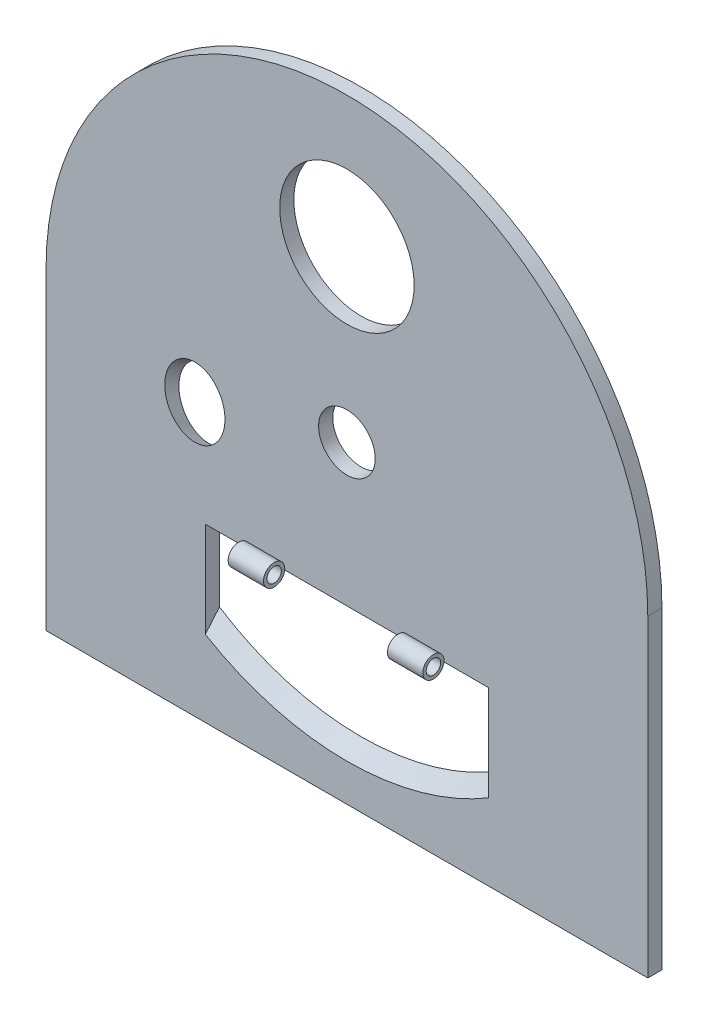
ISO-10303-21;
HEADER;
FILE_DESCRIPTION(('STEP AP214'),'2;1');
FILE_NAME('part.step','',(''),(''),'','','');
FILE_SCHEMA(('AUTOMOTIVE_DESIGN { 1 0 10303 214 1 1 1 1 }'));
ENDSEC;
DATA;
#1=APPLICATION_CONTEXT('core data for automotive mechanical design processes');
#2=APPLICATION_PROTOCOL_DEFINITION('international standard','automotive_design',2000,#1);
#3=PRODUCT_CONTEXT('',#1,'mechanical');
#4=PRODUCT('Part','Part','',(#3));
#5=PRODUCT_RELATED_PRODUCT_CATEGORY('part','',(#4));
#6=PRODUCT_DEFINITION_FORMATION('','',#4);
#7=PRODUCT_DEFINITION_CONTEXT('part definition',#1,'design');
#8=PRODUCT_DEFINITION('design','',#6,#7);
#9=PRODUCT_DEFINITION_SHAPE('','',#8);
#10=(LENGTH_UNIT() NAMED_UNIT(*) SI_UNIT(.MILLI.,.METRE.));
#11=(NAMED_UNIT(*) PLANE_ANGLE_UNIT() SI_UNIT($,.RADIAN.));
#12=(NAMED_UNIT(*) SI_UNIT($,.STERADIAN.) SOLID_ANGLE_UNIT());
#13=UNCERTAINTY_MEASURE_WITH_UNIT(LENGTH_MEASURE(1.E-05),#10,'distance_accuracy_value','');
#14=(GEOMETRIC_REPRESENTATION_CONTEXT(3) GLOBAL_UNCERTAINTY_ASSIGNED_CONTEXT((#13)) GLOBAL_UNIT_ASSIGNED_CONTEXT((#10,
#11,#12)) REPRESENTATION_CONTEXT('',''));
#15=CARTESIAN_POINT('',(0.,0.,0.));
#16=DIRECTION('',(0.,0.,1.));
#17=DIRECTION('',(1.,0.,0.));
#18=AXIS2_PLACEMENT_3D('',#15,#16,#17);
#19=CARTESIAN_POINT('',(-35.,-79.2179302255812,14.1223869730976));
#20=DIRECTION('',(1.,0.,0.));
#21=DIRECTION('',(0.,-1.,0.));
#22=AXIS2_PLACEMENT_3D('',#19,#20,#21);
#23=PLANE('',#22);
#24=CARTESIAN_POINT('',(-35.,-79.2179302255812,14.1223869730976));
#25=DIRECTION('',(-1.,0.,0.));
#26=DIRECTION('',(0.,-1.,0.));
#27=AXIS2_PLACEMENT_3D('',#24,#25,#26);
#28=CIRCLE('',#27,6.00000000000002);
#29=CARTESIAN_POINT('',(-35.,-85.2179302255812,14.1223869730976));
#30=VERTEX_POINT('',#29);
#31=EDGE_CURVE('E11',#30,#30,#28,.T.);
#32=ORIENTED_EDGE('',*,*,#31,.F.);
#33=EDGE_LOOP('',(#32));
#34=FACE_BOUND('',#33,.T.);
#35=CARTESIAN_POINT('',(-35.,-79.2179302255812,14.1223869730976));
#36=DIRECTION('',(-1.,0.,0.));
#37=DIRECTION('',(0.,-1.,0.));
#38=AXIS2_PLACEMENT_3D('',#35,#36,#37);
#39=CIRCLE('',#38,4.07996408059991);
#40=CARTESIAN_POINT('',(-35.,-83.2978943061811,14.1223869730976));
#41=VERTEX_POINT('',#40);
#42=EDGE_CURVE('E51',#41,#41,#39,.T.);
#43=ORIENTED_EDGE('',*,*,#42,.T.);
#44=EDGE_LOOP('',(#43));
#45=FACE_BOUND('',#44,.T.);
#46=ADVANCED_FACE('F40',(#34,#45),#23,.T.);
#47=CARTESIAN_POINT('',(-55.,-79.2179302255812,14.1223869730976));
#48=DIRECTION('',(1.,0.,0.));
#49=DIRECTION('',(0.,-1.,0.));
#50=AXIS2_PLACEMENT_3D('',#47,#48,#49);
#51=PLANE('',#50);
#52=CARTESIAN_POINT('',(-55.,-79.2179302255812,14.1223869730976));
#53=DIRECTION('',(-1.,0.,0.));
#54=DIRECTION('',(0.,-1.,0.));
#55=AXIS2_PLACEMENT_3D('',#52,#53,#54);
#56=CIRCLE('',#55,6.00000000000002);
#57=CARTESIAN_POINT('',(-55.,-85.2179302255812,14.1223869730976));
#58=VERTEX_POINT('',#57);
#59=EDGE_CURVE('E44',#58,#58,#56,.T.);
#60=ORIENTED_EDGE('',*,*,#59,.T.);
#61=EDGE_LOOP('',(#60));
#62=FACE_BOUND('',#61,.T.);
#63=CARTESIAN_POINT('',(-55.,-79.2179302255812,14.1223869730976));
#64=DIRECTION('',(-1.,0.,0.));
#65=DIRECTION('',(0.,-1.,0.));
#66=AXIS2_PLACEMENT_3D('',#63,#64,#65);
#67=CIRCLE('',#66,4.07996408059991);
#68=CARTESIAN_POINT('',(-55.,-83.2978943061811,14.1223869730976));
#69=VERTEX_POINT('',#68);
#70=EDGE_CURVE('E53',#69,#69,#67,.T.);
#71=ORIENTED_EDGE('',*,*,#70,.F.);
#72=EDGE_LOOP('',(#71));
#73=FACE_BOUND('',#72,.T.);
#74=ADVANCED_FACE('F66',(#62,#73),#51,.F.);
#75=CARTESIAN_POINT('',(-35.,-79.2179302255812,14.1223869730976));
#76=DIRECTION('',(-1.,0.,0.));
#77=DIRECTION('',(0.,1.,0.));
#78=AXIS2_PLACEMENT_3D('',#75,#76,#77);
#79=CYLINDRICAL_SURFACE('',#78,6.00000000000002);
#80=ORIENTED_EDGE('',*,*,#31,.T.);
#81=EDGE_LOOP('',(#80));
#82=FACE_BOUND('',#81,.T.);
#83=ORIENTED_EDGE('',*,*,#59,.F.);
#84=EDGE_LOOP('',(#83));
#85=FACE_BOUND('',#84,.T.);
#86=ADVANCED_FACE('F42',(#82,#85),#79,.T.);
#87=CARTESIAN_POINT('',(-35.,-79.2179302255812,14.1223869730976));
#88=DIRECTION('',(-1.,0.,0.));
#89=DIRECTION('',(0.,1.,0.));
#90=AXIS2_PLACEMENT_3D('',#87,#88,#89);
#91=CYLINDRICAL_SURFACE('',#90,4.07996408059991);
#92=ORIENTED_EDGE('',*,*,#42,.F.);
#93=EDGE_LOOP('',(#92));
#94=FACE_BOUND('',#93,.T.);
#95=ORIENTED_EDGE('',*,*,#70,.T.);
#96=EDGE_LOOP('',(#95));
#97=FACE_BOUND('',#96,.T.);
#98=ADVANCED_FACE('F60',(#94,#97),#91,.F.);
#99=CLOSED_SHELL('',(#46,#74,#86,#98));
#100=MANIFOLD_SOLID_BREP('B2',#99);
#101=CARTESIAN_POINT('',(35.,-79.2179302255812,14.1223869730976));
#102=DIRECTION('',(-1.,0.,0.));
#103=DIRECTION('',(0.,-1.,0.));
#104=AXIS2_PLACEMENT_3D('',#101,#102,#103);
#105=PLANE('',#104);
#106=CARTESIAN_POINT('',(35.,-79.2179302255812,14.1223869730976));
#107=DIRECTION('',(-1.,0.,0.));
#108=DIRECTION('',(0.,-1.,0.));
#109=AXIS2_PLACEMENT_3D('',#106,#107,#108);
#110=CIRCLE('',#109,6.00000000000002);
#111=CARTESIAN_POINT('',(35.,-85.2179302255812,14.1223869730976));
#112=VERTEX_POINT('',#111);
#113=EDGE_CURVE('E39',#112,#112,#110,.T.);
#114=ORIENTED_EDGE('',*,*,#113,.T.);
#115=EDGE_LOOP('',(#114));
#116=FACE_BOUND('',#115,.T.);
#117=CARTESIAN_POINT('',(35.,-79.2179302255812,14.1223869730976));
#118=DIRECTION('',(-1.,0.,0.));
#119=DIRECTION('',(0.,-1.,0.));
#120=AXIS2_PLACEMENT_3D('',#117,#118,#119);
#121=CIRCLE('',#120,4.07996408059991);
#122=CARTESIAN_POINT('',(35.,-83.2978943061811,14.1223869730976));
#123=VERTEX_POINT('',#122);
#124=EDGE_CURVE('E122',#123,#123,#121,.T.);
#125=ORIENTED_EDGE('',*,*,#124,.F.);
#126=EDGE_LOOP('',(#125));
#127=FACE_BOUND('',#126,.T.);
#128=ADVANCED_FACE('F111',(#116,#127),#105,.T.);
#129=CARTESIAN_POINT('',(55.,-79.2179302255812,14.1223869730976));
#130=DIRECTION('',(-1.,0.,0.));
#131=DIRECTION('',(0.,-1.,0.));
#132=AXIS2_PLACEMENT_3D('',#129,#130,#131);
#133=PLANE('',#132);
#134=CARTESIAN_POINT('',(55.,-79.2179302255812,14.1223869730976));
#135=DIRECTION('',(-1.,0.,0.));
#136=DIRECTION('',(0.,-1.,0.));
#137=AXIS2_PLACEMENT_3D('',#134,#135,#136);
#138=CIRCLE('',#137,6.00000000000002);
#139=CARTESIAN_POINT('',(55.,-85.2179302255812,14.1223869730976));
#140=VERTEX_POINT('',#139);
#141=EDGE_CURVE('E115',#140,#140,#138,.T.);
#142=ORIENTED_EDGE('',*,*,#141,.F.);
#143=EDGE_LOOP('',(#142));
#144=FACE_BOUND('',#143,.T.);
#145=CARTESIAN_POINT('',(55.,-79.2179302255812,14.1223869730976));
#146=DIRECTION('',(-1.,0.,0.));
#147=DIRECTION('',(0.,-1.,0.));
#148=AXIS2_PLACEMENT_3D('',#145,#146,#147);
#149=CIRCLE('',#148,4.07996408059991);
#150=CARTESIAN_POINT('',(55.,-83.2978943061811,14.1223869730976));
#151=VERTEX_POINT('',#150);
#152=EDGE_CURVE('E124',#151,#151,#149,.T.);
#153=ORIENTED_EDGE('',*,*,#152,.T.);
#154=EDGE_LOOP('',(#153));
#155=FACE_BOUND('',#154,.T.);
#156=ADVANCED_FACE('F134',(#144,#155),#133,.F.);
#157=CARTESIAN_POINT('',(35.,-79.2179302255812,14.1223869730976));
#158=DIRECTION('',(1.,0.,0.));
#159=DIRECTION('',(0.,1.,0.));
#160=AXIS2_PLACEMENT_3D('',#157,#158,#159);
#161=CYLINDRICAL_SURFACE('',#160,6.00000000000002);
#162=ORIENTED_EDGE('',*,*,#113,.F.);
#163=EDGE_LOOP('',(#162));
#164=FACE_BOUND('',#163,.T.);
#165=ORIENTED_EDGE('',*,*,#141,.T.);
#166=EDGE_LOOP('',(#165));
#167=FACE_BOUND('',#166,.T.);
#168=ADVANCED_FACE('F113',(#164,#167),#161,.T.);
#169=CARTESIAN_POINT('',(35.,-79.2179302255812,14.1223869730976));
#170=DIRECTION('',(1.,0.,0.));
#171=DIRECTION('',(0.,1.,0.));
#172=AXIS2_PLACEMENT_3D('',#169,#170,#171);
#173=CYLINDRICAL_SURFACE('',#172,4.07996408059991);
#174=ORIENTED_EDGE('',*,*,#124,.T.);
#175=EDGE_LOOP('',(#174));
#176=FACE_BOUND('',#175,.T.);
#177=ORIENTED_EDGE('',*,*,#152,.F.);
#178=EDGE_LOOP('',(#177));
#179=FACE_BOUND('',#178,.T.);
#180=ADVANCED_FACE('F130',(#176,#179),#173,.F.);
#181=CLOSED_SHELL('',(#128,#156,#168,#180));
#182=MANIFOLD_SOLID_BREP('B6',#181);
#183=CARTESIAN_POINT('',(0.,0.,8.));
#184=DIRECTION('',(0.,0.,1.));
#185=DIRECTION('',(1.,0.,0.));
#186=AXIS2_PLACEMENT_3D('',#183,#184,#185);
#187=PLANE('',#186);
#188=CARTESIAN_POINT('',(-85.9187145176444,-23.2506400164178,8.00000000000001));
#189=DIRECTION('',(0.,0.,1.));
#190=DIRECTION('',(0.,1.,0.));
#191=AXIS2_PLACEMENT_3D('',#188,#189,#190);
#192=ELLIPSE('',#191,19.6299091524473,17.0000000000001);
#193=CARTESIAN_POINT('',(-85.9187145176444,-3.6207308639704,8.00000000000001));
#194=VERTEX_POINT('',#193);
#195=EDGE_CURVE('E360',#194,#194,#192,.T.);
#196=ORIENTED_EDGE('',*,*,#195,.F.);
#197=EDGE_LOOP('',(#196));
#198=FACE_BOUND('',#197,.T.);
#199=CARTESIAN_POINT('',(0.,95.8000683005341,8.));
#200=DIRECTION('',(0.,0.,1.));
#201=DIRECTION('',(1.,0.,0.));
#202=AXIS2_PLACEMENT_3D('',#199,#200,#201);
#203=CIRCLE('',#202,38.);
#204=CARTESIAN_POINT('',(38.,95.8000683005341,8.));
#205=VERTEX_POINT('',#204);
#206=EDGE_CURVE('E355',#205,#205,#203,.T.);
#207=ORIENTED_EDGE('',*,*,#206,.F.);
#208=EDGE_LOOP('',(#207));
#209=FACE_BOUND('',#208,.T.);
#210=DIRECTION('',(0.,1.,0.));
#211=VECTOR('',#210,1.);
#212=CARTESIAN_POINT('',(80.,-80.,8.));
#213=LINE('',#212,#211);
#214=CARTESIAN_POINT('',(80.,-133.925352342266,8.));
#215=VERTEX_POINT('',#214);
#216=CARTESIAN_POINT('',(80.,-80.,8.));
#217=VERTEX_POINT('',#216);
#218=EDGE_CURVE('E190',#215,#217,#213,.T.);
#219=ORIENTED_EDGE('',*,*,#218,.F.);
#220=CARTESIAN_POINT('',(0.,0.,8.));
#221=DIRECTION('',(0.,0.,1.));
#222=DIRECTION('',(1.,0.,0.));
#223=AXIS2_PLACEMENT_3D('',#220,#221,#222);
#224=CIRCLE('',#223,156.);
#225=CARTESIAN_POINT('',(-79.9999999999999,-133.925352342266,8.));
#226=VERTEX_POINT('',#225);
#227=EDGE_CURVE('E299',#215,#226,#224,.F.);
#228=ORIENTED_EDGE('',*,*,#227,.T.);
#229=DIRECTION('',(0.,-1.,0.));
#230=VECTOR('',#229,1.);
#231=CARTESIAN_POINT('',(-80.,-80.,8.));
#232=LINE('',#231,#230);
#233=CARTESIAN_POINT('',(-80.,-80.,8.));
#234=VERTEX_POINT('',#233);
#235=EDGE_CURVE('E197',#234,#226,#232,.T.);
#236=ORIENTED_EDGE('',*,*,#235,.F.);
#237=DIRECTION('',(-1.,0.,0.));
#238=VECTOR('',#237,1.);
#239=CARTESIAN_POINT('',(-80.,-80.,8.));
#240=LINE('',#239,#238);
#241=EDGE_CURVE('E243',#217,#234,#240,.T.);
#242=ORIENTED_EDGE('',*,*,#241,.F.);
#243=EDGE_LOOP('',(#219,#228,#236,#242));
#244=FACE_BOUND('',#243,.T.);
#245=DIRECTION('',(1.,0.,0.));
#246=VECTOR('',#245,1.);
#247=CARTESIAN_POINT('',(-170.,-177.077141787591,8.));
#248=LINE('',#247,#246);
#249=CARTESIAN_POINT('',(-170.,-177.077141787591,8.));
#250=VERTEX_POINT('',#249);
#251=CARTESIAN_POINT('',(170.,-177.077141787591,8.));
#252=VERTEX_POINT('',#251);
#253=EDGE_CURVE('E270',#250,#252,#248,.T.);
#254=ORIENTED_EDGE('',*,*,#253,.T.);
#255=DIRECTION('',(0.,1.,0.));
#256=VECTOR('',#255,1.);
#257=CARTESIAN_POINT('',(170.,0.,8.));
#258=LINE('',#257,#256);
#259=CARTESIAN_POINT('',(170.,0.,8.));
#260=VERTEX_POINT('',#259);
#261=EDGE_CURVE('E273',#252,#260,#258,.T.);
#262=ORIENTED_EDGE('',*,*,#261,.T.);
#263=CARTESIAN_POINT('',(0.,0.,8.));
#264=DIRECTION('',(0.,0.,1.));
#265=DIRECTION('',(1.,0.,0.));
#266=AXIS2_PLACEMENT_3D('',#263,#264,#265);
#267=CIRCLE('',#266,170.);
#268=CARTESIAN_POINT('',(-170.,0.,8.));
#269=VERTEX_POINT('',#268);
#270=EDGE_CURVE('E276',#260,#269,#267,.T.);
#271=ORIENTED_EDGE('',*,*,#270,.T.);
#272=DIRECTION('',(0.,-1.,0.));
#273=VECTOR('',#272,1.);
#274=CARTESIAN_POINT('',(-170.,0.,8.));
#275=LINE('',#274,#273);
#276=EDGE_CURVE('E278',#269,#250,#275,.T.);
#277=ORIENTED_EDGE('',*,*,#276,.T.);
#278=EDGE_LOOP('',(#254,#262,#271,#277));
#279=FACE_BOUND('',#278,.T.);
#280=CARTESIAN_POINT('',(0.,0.,8.));
#281=DIRECTION('',(0.,0.,1.));
#282=DIRECTION('',(1.,0.,0.));
#283=AXIS2_PLACEMENT_3D('',#280,#281,#282);
#284=CIRCLE('',#283,16.);
#285=CARTESIAN_POINT('',(16.,0.,8.));
#286=VERTEX_POINT('',#285);
#287=EDGE_CURVE('E264',#286,#286,#284,.T.);
#288=ORIENTED_EDGE('',*,*,#287,.F.);
#289=EDGE_LOOP('',(#288));
#290=FACE_BOUND('',#289,.T.);
#291=ADVANCED_FACE('F173',(#198,#209,#244,#279,#290),#187,.T.);
#292=CARTESIAN_POINT('',(0.,0.,0.));
#293=DIRECTION('',(0.,0.,1.));
#294=DIRECTION('',(1.,0.,0.));
#295=AXIS2_PLACEMENT_3D('',#292,#293,#294);
#296=PLANE('',#295);
#297=CARTESIAN_POINT('',(-85.9187145176444,-27.8694421699348,0.));
#298=DIRECTION('',(0.,0.,1.));
#299=DIRECTION('',(0.,1.,0.));
#300=AXIS2_PLACEMENT_3D('',#297,#298,#299);
#301=ELLIPSE('',#300,19.6299091524473,17.0000000000001);
#302=CARTESIAN_POINT('',(-85.9187145176444,-8.23953301748742,0.));
#303=VERTEX_POINT('',#302);
#304=EDGE_CURVE('E178',#303,#303,#301,.T.);
#305=ORIENTED_EDGE('',*,*,#304,.T.);
#306=EDGE_LOOP('',(#305));
#307=FACE_BOUND('',#306,.T.);
#308=DIRECTION('',(1.,0.,0.));
#309=VECTOR('',#308,1.);
#310=CARTESIAN_POINT('',(-170.,-177.077141787591,0.));
#311=LINE('',#310,#309);
#312=CARTESIAN_POINT('',(-170.,-177.077141787591,0.));
#313=VERTEX_POINT('',#312);
#314=CARTESIAN_POINT('',(170.,-177.077141787591,0.));
#315=VERTEX_POINT('',#314);
#316=EDGE_CURVE('E252',#313,#315,#311,.T.);
#317=ORIENTED_EDGE('',*,*,#316,.F.);
#318=DIRECTION('',(0.,-1.,0.));
#319=VECTOR('',#318,1.);
#320=CARTESIAN_POINT('',(-170.,0.,0.));
#321=LINE('',#320,#319);
#322=CARTESIAN_POINT('',(-170.,0.,0.));
#323=VERTEX_POINT('',#322);
#324=EDGE_CURVE('E274',#323,#313,#321,.T.);
#325=ORIENTED_EDGE('',*,*,#324,.F.);
#326=CARTESIAN_POINT('',(0.,0.,0.));
#327=DIRECTION('',(0.,0.,1.));
#328=DIRECTION('',(1.,0.,0.));
#329=AXIS2_PLACEMENT_3D('',#326,#327,#328);
#330=CIRCLE('',#329,170.);
#331=CARTESIAN_POINT('',(170.,0.,0.));
#332=VERTEX_POINT('',#331);
#333=EDGE_CURVE('E285',#332,#323,#330,.T.);
#334=ORIENTED_EDGE('',*,*,#333,.F.);
#335=DIRECTION('',(0.,1.,0.));
#336=VECTOR('',#335,1.);
#337=CARTESIAN_POINT('',(170.,0.,0.));
#338=LINE('',#337,#336);
#339=EDGE_CURVE('E283',#315,#332,#338,.T.);
#340=ORIENTED_EDGE('',*,*,#339,.F.);
#341=EDGE_LOOP('',(#317,#325,#334,#340));
#342=FACE_BOUND('',#341,.T.);
#343=CARTESIAN_POINT('',(0.,0.,0.));
#344=DIRECTION('',(0.,0.,1.));
#345=DIRECTION('',(1.,0.,0.));
#346=AXIS2_PLACEMENT_3D('',#343,#344,#345);
#347=CIRCLE('',#346,148.);
#348=CARTESIAN_POINT('',(-79.9999999999999,-124.515059330187,0.));
#349=VERTEX_POINT('',#348);
#350=CARTESIAN_POINT('',(80.,-124.515059330187,0.));
#351=VERTEX_POINT('',#350);
#352=EDGE_CURVE('E260',#349,#351,#347,.T.);
#353=ORIENTED_EDGE('',*,*,#352,.T.);
#354=DIRECTION('',(0.,1.,0.));
#355=VECTOR('',#354,1.);
#356=CARTESIAN_POINT('',(80.,-80.,0.));
#357=LINE('',#356,#355);
#358=CARTESIAN_POINT('',(80.,-80.,0.));
#359=VERTEX_POINT('',#358);
#360=EDGE_CURVE('E263',#351,#359,#357,.T.);
#361=ORIENTED_EDGE('',*,*,#360,.T.);
#362=DIRECTION('',(-1.,0.,0.));
#363=VECTOR('',#362,1.);
#364=CARTESIAN_POINT('',(-80.,-80.,0.));
#365=LINE('',#364,#363);
#366=CARTESIAN_POINT('',(-80.,-80.,0.));
#367=VERTEX_POINT('',#366);
#368=EDGE_CURVE('E250',#359,#367,#365,.T.);
#369=ORIENTED_EDGE('',*,*,#368,.T.);
#370=DIRECTION('',(0.,-1.,0.));
#371=VECTOR('',#370,1.);
#372=CARTESIAN_POINT('',(-80.,-80.,0.));
#373=LINE('',#372,#371);
#374=EDGE_CURVE('E244',#367,#349,#373,.T.);
#375=ORIENTED_EDGE('',*,*,#374,.T.);
#376=EDGE_LOOP('',(#353,#361,#369,#375));
#377=FACE_BOUND('',#376,.T.);
#378=CARTESIAN_POINT('',(0.,0.,0.));
#379=DIRECTION('',(0.,0.,1.));
#380=DIRECTION('',(1.,0.,0.));
#381=AXIS2_PLACEMENT_3D('',#378,#379,#380);
#382=CIRCLE('',#381,16.);
#383=CARTESIAN_POINT('',(16.,0.,0.));
#384=VERTEX_POINT('',#383);
#385=EDGE_CURVE('E352',#384,#384,#382,.T.);
#386=ORIENTED_EDGE('',*,*,#385,.T.);
#387=EDGE_LOOP('',(#386));
#388=FACE_BOUND('',#387,.T.);
#389=CARTESIAN_POINT('',(0.,95.8000683005341,0.));
#390=DIRECTION('',(0.,0.,1.));
#391=DIRECTION('',(1.,0.,0.));
#392=AXIS2_PLACEMENT_3D('',#389,#390,#391);
#393=CIRCLE('',#392,38.);
#394=CARTESIAN_POINT('',(38.,95.8000683005341,0.));
#395=VERTEX_POINT('',#394);
#396=EDGE_CURVE('E357',#395,#395,#393,.T.);
#397=ORIENTED_EDGE('',*,*,#396,.T.);
#398=EDGE_LOOP('',(#397));
#399=FACE_BOUND('',#398,.T.);
#400=ADVANCED_FACE('F316',(#307,#342,#377,#388,#399),#296,.F.);
#401=CARTESIAN_POINT('',(-170.,-177.077141787591,8.));
#402=DIRECTION('',(0.,1.,0.));
#403=DIRECTION('',(0.,0.,1.));
#404=AXIS2_PLACEMENT_3D('',#401,#402,#403);
#405=PLANE('',#404);
#406=ORIENTED_EDGE('',*,*,#316,.T.);
#407=DIRECTION('',(0.,0.,-1.));
#408=VECTOR('',#407,1.);
#409=CARTESIAN_POINT('',(170.,-177.077141787591,8.));
#410=LINE('',#409,#408);
#411=EDGE_CURVE('E296',#252,#315,#410,.T.);
#412=ORIENTED_EDGE('',*,*,#411,.F.);
#413=ORIENTED_EDGE('',*,*,#253,.F.);
#414=DIRECTION('',(0.,0.,-1.));
#415=VECTOR('',#414,1.);
#416=CARTESIAN_POINT('',(-170.,-177.077141787591,8.));
#417=LINE('',#416,#415);
#418=EDGE_CURVE('E280',#250,#313,#417,.T.);
#419=ORIENTED_EDGE('',*,*,#418,.T.);
#420=EDGE_LOOP('',(#406,#412,#413,#419));
#421=FACE_BOUND('',#420,.T.);
#422=ADVANCED_FACE('F320',(#421),#405,.F.);
#423=CARTESIAN_POINT('',(170.,0.,8.));
#424=DIRECTION('',(-1.,0.,0.));
#425=DIRECTION('',(0.,0.,1.));
#426=AXIS2_PLACEMENT_3D('',#423,#424,#425);
#427=PLANE('',#426);
#428=ORIENTED_EDGE('',*,*,#339,.T.);
#429=DIRECTION('',(0.,0.,-1.));
#430=VECTOR('',#429,1.);
#431=CARTESIAN_POINT('',(170.,0.,8.));
#432=LINE('',#431,#430);
#433=EDGE_CURVE('E293',#260,#332,#432,.T.);
#434=ORIENTED_EDGE('',*,*,#433,.F.);
#435=ORIENTED_EDGE('',*,*,#261,.F.);
#436=ORIENTED_EDGE('',*,*,#411,.T.);
#437=EDGE_LOOP('',(#428,#434,#435,#436));
#438=FACE_BOUND('',#437,.T.);
#439=ADVANCED_FACE('F328',(#438),#427,.F.);
#440=CARTESIAN_POINT('',(0.,0.,8.));
#441=DIRECTION('',(0.,0.,-1.));
#442=DIRECTION('',(-1.,0.,0.));
#443=AXIS2_PLACEMENT_3D('',#440,#441,#442);
#444=CYLINDRICAL_SURFACE('',#443,170.);
#445=ORIENTED_EDGE('',*,*,#333,.T.);
#446=DIRECTION('',(0.,0.,-1.));
#447=VECTOR('',#446,1.);
#448=CARTESIAN_POINT('',(-170.,0.,8.));
#449=LINE('',#448,#447);
#450=EDGE_CURVE('E290',#269,#323,#449,.T.);
#451=ORIENTED_EDGE('',*,*,#450,.F.);
#452=ORIENTED_EDGE('',*,*,#270,.F.);
#453=ORIENTED_EDGE('',*,*,#433,.T.);
#454=EDGE_LOOP('',(#445,#451,#452,#453));
#455=FACE_BOUND('',#454,.T.);
#456=ADVANCED_FACE('F324',(#455),#444,.T.);
#457=CARTESIAN_POINT('',(-170.,0.,8.));
#458=DIRECTION('',(1.,0.,0.));
#459=DIRECTION('',(0.,1.,0.));
#460=AXIS2_PLACEMENT_3D('',#457,#458,#459);
#461=PLANE('',#460);
#462=ORIENTED_EDGE('',*,*,#324,.T.);
#463=ORIENTED_EDGE('',*,*,#418,.F.);
#464=ORIENTED_EDGE('',*,*,#276,.F.);
#465=ORIENTED_EDGE('',*,*,#450,.T.);
#466=EDGE_LOOP('',(#462,#463,#464,#465));
#467=FACE_BOUND('',#466,.T.);
#468=ADVANCED_FACE('F313',(#467),#461,.F.);
#469=CARTESIAN_POINT('',(80.,-80.,8.));
#470=DIRECTION('',(-1.,0.,0.));
#471=DIRECTION('',(0.,-1.,0.));
#472=AXIS2_PLACEMENT_3D('',#469,#470,#471);
#473=PLANE('',#472);
#474=ORIENTED_EDGE('',*,*,#360,.F.);
#475=CARTESIAN_POINT('',(80.,-124.515059330187,0.));
#476=CARTESIAN_POINT('',(80.,-125.302671391759,0.662633860293752));
#477=CARTESIAN_POINT('',(80.,-126.0893798906,1.32634117210435));
#478=CARTESIAN_POINT('',(80.,-127.661059072892,2.65580041994284));
#479=CARTESIAN_POINT('',(80.,-128.446029767101,3.32155234325222));
#480=CARTESIAN_POINT('',(80.,-130.014312059654,4.65500645232849));
#481=CARTESIAN_POINT('',(80.,-130.797623658774,5.3227086371809));
#482=CARTESIAN_POINT('',(80.,-132.362661309583,6.6599785135978));
#483=CARTESIAN_POINT('',(80.,-133.144387351399,7.32954621671707));
#484=CARTESIAN_POINT('',(80.,-133.925352342266,8.00000000000001));
#485=B_SPLINE_CURVE_WITH_KNOTS('',3,(#475,#476,#477,#478,#479,#480,#481,#482,#483,#484),
.UNSPECIFIED.,.F.,.F.,(4,2,2,2,4),(0.,3.08783720201881,6.17565523488229,9.26347182007585,
12.3513075734816),.UNSPECIFIED.);
#486=EDGE_CURVE('E183',#351,#215,#485,.T.);
#487=ORIENTED_EDGE('',*,*,#486,.T.);
#488=ORIENTED_EDGE('',*,*,#218,.T.);
#489=DIRECTION('',(0.,0.,-1.));
#490=VECTOR('',#489,1.);
#491=CARTESIAN_POINT('',(80.,-80.,8.));
#492=LINE('',#491,#490);
#493=EDGE_CURVE('E240',#217,#359,#492,.T.);
#494=ORIENTED_EDGE('',*,*,#493,.T.);
#495=EDGE_LOOP('',(#474,#487,#488,#494));
#496=FACE_BOUND('',#495,.T.);
#497=ADVANCED_FACE('F239',(#496),#473,.T.);
#498=CARTESIAN_POINT('',(-80.,-80.,8.));
#499=DIRECTION('',(0.,-1.,0.));
#500=DIRECTION('',(0.,0.,-1.));
#501=AXIS2_PLACEMENT_3D('',#498,#499,#500);
#502=PLANE('',#501);
#503=ORIENTED_EDGE('',*,*,#368,.F.);
#504=ORIENTED_EDGE('',*,*,#493,.F.);
#505=ORIENTED_EDGE('',*,*,#241,.T.);
#506=DIRECTION('',(0.,0.,-1.));
#507=VECTOR('',#506,1.);
#508=CARTESIAN_POINT('',(-80.,-80.,8.));
#509=LINE('',#508,#507);
#510=EDGE_CURVE('E253',#234,#367,#509,.T.);
#511=ORIENTED_EDGE('',*,*,#510,.T.);
#512=EDGE_LOOP('',(#503,#504,#505,#511));
#513=FACE_BOUND('',#512,.T.);
#514=ADVANCED_FACE('F248',(#513),#502,.T.);
#515=CARTESIAN_POINT('',(-80.,-80.,8.));
#516=DIRECTION('',(1.,0.,0.));
#517=DIRECTION('',(0.,1.,0.));
#518=AXIS2_PLACEMENT_3D('',#515,#516,#517);
#519=PLANE('',#518);
#520=ORIENTED_EDGE('',*,*,#374,.F.);
#521=ORIENTED_EDGE('',*,*,#510,.F.);
#522=ORIENTED_EDGE('',*,*,#235,.T.);
#523=CARTESIAN_POINT('',(-79.9999999999999,-133.925352342266,8.));
#524=CARTESIAN_POINT('',(-79.9999999999999,-133.144387351398,7.32954621671706));
#525=CARTESIAN_POINT('',(-79.9999999999999,-132.362661309583,6.6599785135978));
#526=CARTESIAN_POINT('',(-79.9999999999999,-130.797623658774,5.32270863718089));
#527=CARTESIAN_POINT('',(-79.9999999999999,-130.014312059654,4.65500645232848));
#528=CARTESIAN_POINT('',(-79.9999999999999,-128.446029767101,3.32155234325219));
#529=CARTESIAN_POINT('',(-79.9999999999999,-127.661059072892,2.65580041994281));
#530=CARTESIAN_POINT('',(-79.9999999999999,-126.0893798906,1.32634117210432));
#531=CARTESIAN_POINT('',(-79.9999999999999,-125.302671391759,0.662633860293742));
#532=CARTESIAN_POINT('',(-79.9999999999999,-124.515059330187,0.));
#533=B_SPLINE_CURVE_WITH_KNOTS('',3,(#523,#524,#525,#526,#527,#528,#529,#530,#531,#532),
.UNSPECIFIED.,.F.,.F.,(4,2,2,2,4),(0.,3.08783575340578,6.17565233859935,9.26347037146286,
12.3513075734816),.UNSPECIFIED.);
#534=EDGE_CURVE('E109',#226,#349,#533,.T.);
#535=ORIENTED_EDGE('',*,*,#534,.T.);
#536=EDGE_LOOP('',(#520,#521,#522,#535));
#537=FACE_BOUND('',#536,.T.);
#538=ADVANCED_FACE('F383',(#537),#519,.T.);
#539=CARTESIAN_POINT('',(0.,0.,8.));
#540=DIRECTION('',(0.,0.,-1.));
#541=DIRECTION('',(-1.,0.,0.));
#542=AXIS2_PLACEMENT_3D('',#539,#540,#541);
#543=CYLINDRICAL_SURFACE('',#542,16.);
#544=ORIENTED_EDGE('',*,*,#287,.T.);
#545=EDGE_LOOP('',(#544));
#546=FACE_BOUND('',#545,.T.);
#547=ORIENTED_EDGE('',*,*,#385,.F.);
#548=EDGE_LOOP('',(#547));
#549=FACE_BOUND('',#548,.T.);
#550=ADVANCED_FACE('F380',(#546,#549),#543,.F.);
#551=CARTESIAN_POINT('',(0.,95.8000683005341,8.));
#552=DIRECTION('',(0.,0.,-1.));
#553=DIRECTION('',(-1.,0.,0.));
#554=AXIS2_PLACEMENT_3D('',#551,#552,#553);
#555=CYLINDRICAL_SURFACE('',#554,38.);
#556=ORIENTED_EDGE('',*,*,#206,.T.);
#557=EDGE_LOOP('',(#556));
#558=FACE_BOUND('',#557,.T.);
#559=ORIENTED_EDGE('',*,*,#396,.F.);
#560=EDGE_LOOP('',(#559));
#561=FACE_BOUND('',#560,.T.);
#562=ADVANCED_FACE('F375',(#558,#561),#555,.F.);
#563=CARTESIAN_POINT('',(0.,0.,0.));
#564=DIRECTION('',(0.,0.,1.));
#565=DIRECTION('',(1.,0.,0.));
#566=AXIS2_PLACEMENT_3D('',#563,#564,#565);
#567=CONICAL_SURFACE('',#566,148.,0.78539816339745);
#568=ORIENTED_EDGE('',*,*,#534,.F.);
#569=ORIENTED_EDGE('',*,*,#227,.F.);
#570=ORIENTED_EDGE('',*,*,#486,.F.);
#571=ORIENTED_EDGE('',*,*,#352,.F.);
#572=EDGE_LOOP('',(#568,#569,#570,#571));
#573=FACE_BOUND('',#572,.T.);
#574=ADVANCED_FACE('F175',(#573),#567,.F.);
#575=CARTESIAN_POINT('',(-85.9187145176444,-65.1713670743489,-64.608829154564));
#576=DIRECTION('',(0.,0.500000000000001,0.866025403784438));
#577=DIRECTION('',(0.,-0.866025403784438,0.500000000000001));
#578=AXIS2_PLACEMENT_3D('',#575,#576,#577);
#579=CYLINDRICAL_SURFACE('',#578,17.0000000000001);
#580=ORIENTED_EDGE('',*,*,#195,.T.);
#581=EDGE_LOOP('',(#580));
#582=FACE_BOUND('',#581,.T.);
#583=ORIENTED_EDGE('',*,*,#304,.F.);
#584=EDGE_LOOP('',(#583));
#585=FACE_BOUND('',#584,.T.);
#586=ADVANCED_FACE('F369',(#582,#585),#579,.F.);
#587=CLOSED_SHELL('',(#291,#400,#422,#439,#456,#468,#497,#514,#538,#550,#562,#574,#586));
#588=MANIFOLD_SOLID_BREP('B34',#587);
#589=ADVANCED_BREP_SHAPE_REPRESENTATION('',(#18,#100,#182,#588),#14);
#590=SHAPE_DEFINITION_REPRESENTATION(#9,#589);
ENDSEC;
END-ISO-10303-21;
